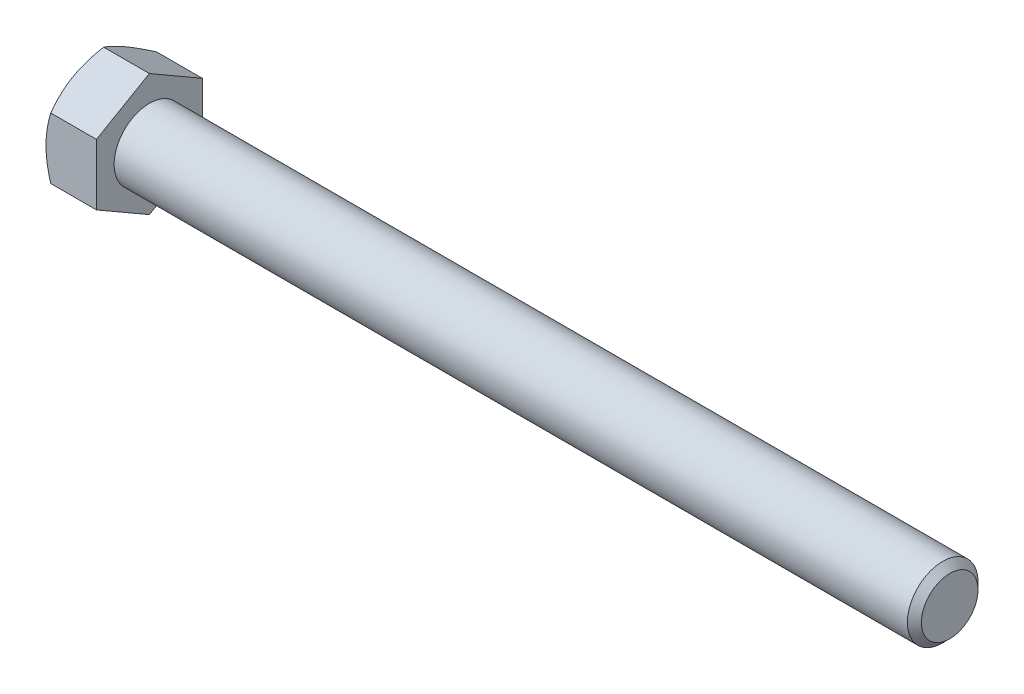
ISO-10303-21;
HEADER;
FILE_DESCRIPTION(('STEP AP214'),'2;1');
FILE_NAME('part.step','',(''),(''),'','','');
FILE_SCHEMA(('AUTOMOTIVE_DESIGN { 1 0 10303 214 1 1 1 1 }'));
ENDSEC;
DATA;
#1=APPLICATION_CONTEXT('core data for automotive mechanical design processes');
#2=APPLICATION_PROTOCOL_DEFINITION('international standard','automotive_design',2000,#1);
#3=PRODUCT_CONTEXT('',#1,'mechanical');
#4=PRODUCT('Part','Part','',(#3));
#5=PRODUCT_RELATED_PRODUCT_CATEGORY('part','',(#4));
#6=PRODUCT_DEFINITION_FORMATION('','',#4);
#7=PRODUCT_DEFINITION_CONTEXT('part definition',#1,'design');
#8=PRODUCT_DEFINITION('design','',#6,#7);
#9=PRODUCT_DEFINITION_SHAPE('','',#8);
#10=(LENGTH_UNIT() NAMED_UNIT(*) SI_UNIT(.MILLI.,.METRE.));
#11=(NAMED_UNIT(*) PLANE_ANGLE_UNIT() SI_UNIT($,.RADIAN.));
#12=(NAMED_UNIT(*) SI_UNIT($,.STERADIAN.) SOLID_ANGLE_UNIT());
#13=UNCERTAINTY_MEASURE_WITH_UNIT(LENGTH_MEASURE(1.E-05),#10,'distance_accuracy_value','');
#14=(GEOMETRIC_REPRESENTATION_CONTEXT(3) GLOBAL_UNCERTAINTY_ASSIGNED_CONTEXT((#13)) GLOBAL_UNIT_ASSIGNED_CONTEXT((#10,
#11,#12)) REPRESENTATION_CONTEXT('',''));
#15=CARTESIAN_POINT('',(0.,0.,0.));
#16=DIRECTION('',(0.,0.,1.));
#17=DIRECTION('',(1.,0.,0.));
#18=AXIS2_PLACEMENT_3D('',#15,#16,#17);
#19=CARTESIAN_POINT('',(6.8072,4.12077981131403,-7.1374));
#20=DIRECTION('',(0.,-0.866025403784438,0.500000000000001));
#21=DIRECTION('',(0.,-0.500000000000001,-0.866025403784438));
#22=AXIS2_PLACEMENT_3D('',#19,#20,#21);
#23=PLANE('',#22);
#24=CARTESIAN_POINT('',(0.637553523420348,8.24167509268191,0.000199999999999582));
#25=CARTESIAN_POINT('',(0.585265389565359,8.15109571898021,-0.156688077369111));
#26=CARTESIAN_POINT('',(0.535350289912886,8.06017862158373,-0.314161109336512));
#27=CARTESIAN_POINT('',(0.440919739394811,7.87760608276958,-0.630386022629451));
#28=CARTESIAN_POINT('',(0.396406617864103,7.78595034088604,-0.789138424377166));
#29=CARTESIAN_POINT('',(0.2718439466046,7.50951559742938,-1.26793744502137));
#30=CARTESIAN_POINT('',(0.200994122533562,7.32364541554993,-1.58987404364865));
#31=CARTESIAN_POINT('',(0.117914357261567,7.04549407114397,-2.07164630435335));
#32=CARTESIAN_POINT('',(0.0942473375753679,6.95404399131372,-2.23004248897558));
#33=CARTESIAN_POINT('',(0.0545611977075647,6.77073061920728,-2.54755056317072));
#34=CARTESIAN_POINT('',(0.0385414017966341,6.67886736416472,-2.70666238825308));
#35=CARTESIAN_POINT('',(0.0145579786669824,6.49498130931768,-3.02516237805154));
#36=CARTESIAN_POINT('',(0.00658520869042867,6.40295880983915,-3.18455002258784));
#37=CARTESIAN_POINT('',(-0.00114175893561541,6.21883388819856,-3.50346374180898));
#38=CARTESIAN_POINT('',(-0.000896210482461266,6.12673146859347,-3.66298981206503));
#39=CARTESIAN_POINT('',(0.0110730517201773,5.87440161908354,-4.10003793168242));
#40=CARTESIAN_POINT('',(0.0311658852990926,5.71425679021456,-4.37741691185292));
#41=CARTESIAN_POINT('',(0.0948800883359072,5.39503079963205,-4.93033254663834));
#42=CARTESIAN_POINT('',(0.13852323430896,5.23595076056063,-5.20586725678008));
#43=CARTESIAN_POINT('',(0.247618299095075,4.91608234409664,-5.75989560583231));
#44=CARTESIAN_POINT('',(0.31353243599271,4.75533432745402,-6.03831933787326));
#45=CARTESIAN_POINT('',(0.463130880450463,4.43623548204411,-6.59101475075978));
#46=CARTESIAN_POINT('',(0.546780048637372,4.27788056676996,-6.86529350964288));
#47=CARTESIAN_POINT('',(0.637553523420343,4.12066434126019,-7.1376));
#48=B_SPLINE_CURVE_WITH_KNOTS('',3,(#24,#25,#26,#27,#28,#29,#30,#31,#32,#33,#34,#35,#36,#37,#38,
#39,#40,#41,#42,#43,#44,#45,#46,#47),.UNSPECIFIED.,.F.,.F.,(4,2,2,2,2,2,2,2,2,2,2,4),(0.,
0.565616271543687,1.13147557690344,2.26554547664276,2.81869146049269,3.37178855781927,
3.9242565351942,4.47670744459711,5.43845614829341,6.40109569003608,7.3850851165131,
8.36714283329691),.UNSPECIFIED.);
#49=CARTESIAN_POINT('',(0.637486855352631,8.24155962262808,0.));
#50=VERTEX_POINT('',#49);
#51=CARTESIAN_POINT('',(0.,6.18116971697105,-3.56870000000001));
#52=VERTEX_POINT('',#51);
#53=EDGE_CURVE('E53',#50,#52,#48,.T.);
#54=ORIENTED_EDGE('',*,*,#53,.F.);
#55=DIRECTION('',(-1.,0.,0.));
#56=VECTOR('',#55,1.);
#57=CARTESIAN_POINT('',(6.8072,8.24155962262808,0.));
#58=LINE('',#57,#56);
#59=CARTESIAN_POINT('',(6.8072,8.24155962262808,0.));
#60=VERTEX_POINT('',#59);
#61=EDGE_CURVE('E149',#60,#50,#58,.T.);
#62=ORIENTED_EDGE('',*,*,#61,.F.);
#63=DIRECTION('',(0.,0.500000000000001,0.866025403784438));
#64=VECTOR('',#63,1.);
#65=CARTESIAN_POINT('',(6.8072,4.12077981131403,-7.1374));
#66=LINE('',#65,#64);
#67=CARTESIAN_POINT('',(6.8072,4.12077981131403,-7.1374));
#68=VERTEX_POINT('',#67);
#69=EDGE_CURVE('E240',#68,#60,#66,.T.);
#70=ORIENTED_EDGE('',*,*,#69,.F.);
#71=DIRECTION('',(-1.,0.,0.));
#72=VECTOR('',#71,1.);
#73=CARTESIAN_POINT('',(6.8072,4.12077981131403,-7.1374));
#74=LINE('',#73,#72);
#75=CARTESIAN_POINT('',(0.637486855352625,4.12077981131403,-7.1374));
#76=VERTEX_POINT('',#75);
#77=EDGE_CURVE('E137',#68,#76,#74,.T.);
#78=ORIENTED_EDGE('',*,*,#77,.T.);
#79=EDGE_CURVE('E131',#52,#76,#48,.T.);
#80=ORIENTED_EDGE('',*,*,#79,.F.);
#81=EDGE_LOOP('',(#54,#62,#70,#78,#80));
#82=FACE_BOUND('',#81,.T.);
#83=ADVANCED_FACE('F37',(#82),#23,.F.);
#84=CARTESIAN_POINT('',(6.8072,8.24155962262808,0.));
#85=DIRECTION('',(0.,-0.866025403784438,-0.500000000000001));
#86=DIRECTION('',(0.,0.500000000000001,-0.866025403784438));
#87=AXIS2_PLACEMENT_3D('',#84,#85,#86);
#88=PLANE('',#87);
#89=CARTESIAN_POINT('',(0.637553523420344,4.12066434126019,7.1376));
#90=CARTESIAN_POINT('',(0.585265389565354,4.21124371496189,6.98071192263089));
#91=CARTESIAN_POINT('',(0.535350289912882,4.30216081235838,6.82323889066349));
#92=CARTESIAN_POINT('',(0.440919739394807,4.48473335117252,6.50701397737055));
#93=CARTESIAN_POINT('',(0.3964066178641,4.57638909305606,6.34826157562283));
#94=CARTESIAN_POINT('',(0.271843946604597,4.85282383651273,5.86946255497863));
#95=CARTESIAN_POINT('',(0.20099412253356,5.03869401839218,5.54752595635135));
#96=CARTESIAN_POINT('',(0.117914357261566,5.31684536279814,5.06575369564665));
#97=CARTESIAN_POINT('',(0.094247337575367,5.40829544262839,4.90735751102442));
#98=CARTESIAN_POINT('',(0.0545611977075641,5.59160881473483,4.58984943682928));
#99=CARTESIAN_POINT('',(0.0385414017966333,5.68347206977738,4.43073761174692));
#100=CARTESIAN_POINT('',(0.0145579786669821,5.86735812462442,4.11223762194846));
#101=CARTESIAN_POINT('',(0.00658520869042904,5.95938062410295,3.95284997741216));
#102=CARTESIAN_POINT('',(-0.00114175893561427,6.14350554574354,3.63393625819102));
#103=CARTESIAN_POINT('',(-0.000896210482460006,6.23560796534864,3.47441018793497));
#104=CARTESIAN_POINT('',(0.0110730517201789,6.48793781485856,3.03736206831758));
#105=CARTESIAN_POINT('',(0.0311658852990944,6.64808264372754,2.75998308814708));
#106=CARTESIAN_POINT('',(0.0948800883359096,6.96730863431005,2.20706745336167));
#107=CARTESIAN_POINT('',(0.138523234308963,7.12638867338148,1.93153274321992));
#108=CARTESIAN_POINT('',(0.24761829909508,7.44625708984546,1.37750439416769));
#109=CARTESIAN_POINT('',(0.313532435992716,7.60700510648809,1.09908066212674));
#110=CARTESIAN_POINT('',(0.463130880450469,7.926103951898,0.546385249240216));
#111=CARTESIAN_POINT('',(0.546780048637379,8.08445886717215,0.272106490357122));
#112=CARTESIAN_POINT('',(0.637553523420349,8.24167509268191,-0.000199999999999955));
#113=B_SPLINE_CURVE_WITH_KNOTS('',3,(#89,#90,#91,#92,#93,#94,#95,#96,#97,#98,#99,#100,#101,#102,
#103,#104,#105,#106,#107,#108,#109,#110,#111,#112),.UNSPECIFIED.,.F.,.F.,(4,2,2,2,2,2,2,2,2,2,2,
4),(0.,0.565616271543686,1.13147557690344,2.26554547664276,2.81869146049269,3.37178855781927,
3.92425653519419,4.4767074445971,5.4384561482934,6.40109569003607,7.3850851165131,
8.36714283329691),.UNSPECIFIED.);
#114=CARTESIAN_POINT('',(0.637486855352626,4.12077981131403,7.1374));
#115=VERTEX_POINT('',#114);
#116=CARTESIAN_POINT('',(0.,6.18116971697105,3.56870000000001));
#117=VERTEX_POINT('',#116);
#118=EDGE_CURVE('E60',#115,#117,#113,.T.);
#119=ORIENTED_EDGE('',*,*,#118,.F.);
#120=DIRECTION('',(-1.,0.,0.));
#121=VECTOR('',#120,1.);
#122=CARTESIAN_POINT('',(6.8072,4.12077981131403,7.1374));
#123=LINE('',#122,#121);
#124=CARTESIAN_POINT('',(6.8072,4.12077981131403,7.1374));
#125=VERTEX_POINT('',#124);
#126=EDGE_CURVE('E147',#125,#115,#123,.T.);
#127=ORIENTED_EDGE('',*,*,#126,.F.);
#128=DIRECTION('',(0.,-0.500000000000001,0.866025403784438));
#129=VECTOR('',#128,1.);
#130=CARTESIAN_POINT('',(6.8072,8.24155962262808,0.));
#131=LINE('',#130,#129);
#132=EDGE_CURVE('E238',#60,#125,#131,.T.);
#133=ORIENTED_EDGE('',*,*,#132,.F.);
#134=ORIENTED_EDGE('',*,*,#61,.T.);
#135=EDGE_CURVE('E164',#117,#50,#113,.T.);
#136=ORIENTED_EDGE('',*,*,#135,.F.);
#137=EDGE_LOOP('',(#119,#127,#133,#134,#136));
#138=FACE_BOUND('',#137,.T.);
#139=ADVANCED_FACE('F170',(#138),#88,.F.);
#140=CARTESIAN_POINT('',(6.8072,4.12077981131403,7.1374));
#141=DIRECTION('',(0.,0.,-1.));
#142=DIRECTION('',(-1.,0.,0.));
#143=AXIS2_PLACEMENT_3D('',#140,#141,#142);
#144=PLANE('',#143);
#145=CARTESIAN_POINT('',(3.51793891464087,-11.1403587268437,7.1374));
#146=CARTESIAN_POINT('',(3.36611761361542,-10.8279722926893,7.1374));
#147=CARTESIAN_POINT('',(3.21573167435817,-10.5148763007017,7.1374));
#148=CARTESIAN_POINT('',(2.91863653133452,-9.88688803265219,7.1374));
#149=CARTESIAN_POINT('',(2.77192789362364,-9.57199548909054,7.1374));
#150=CARTESIAN_POINT('',(2.48227074397641,-8.93844907707202,7.1374));
#151=CARTESIAN_POINT('',(2.33934643030355,-8.61978410734441,7.1374));
#152=CARTESIAN_POINT('',(2.05925336317275,-7.97994405772779,7.1374));
#153=CARTESIAN_POINT('',(1.92208434228597,-7.65876909529408,7.1374));
#154=CARTESIAN_POINT('',(1.65065378230837,-7.00284865103085,7.1374));
#155=CARTESIAN_POINT('',(1.51663374065787,-6.66800268560584,7.1374));
#156=CARTESIAN_POINT('',(1.25856485288051,-5.99442084818065,7.1374));
#157=CARTESIAN_POINT('',(1.13451711533335,-5.6556845484785,7.1374));
#158=CARTESIAN_POINT('',(0.899596727677592,-4.97438980758155,7.1374));
#159=CARTESIAN_POINT('',(0.78869803674292,-4.63184044199148,7.1374));
#160=CARTESIAN_POINT('',(0.583585288609215,-3.94184101121261,7.1374));
#161=CARTESIAN_POINT('',(0.489366053461915,-3.5943925031972,7.1374));
#162=CARTESIAN_POINT('',(0.322585119775289,-2.89623643412328,7.1374));
#163=CARTESIAN_POINT('',(0.249906108267923,-2.54555766855628,7.1374));
#164=CARTESIAN_POINT('',(0.160162927876226,-2.01629019056175,7.1374));
#165=CARTESIAN_POINT('',(0.133459926561135,-1.83931395899738,7.1374));
#166=CARTESIAN_POINT('',(0.0870009608751859,-1.48445773938035,7.1374));
#167=CARTESIAN_POINT('',(0.0672443235865576,-1.3065778405635,7.1374));
#168=CARTESIAN_POINT('',(0.0353233928817906,-0.952509042934671,7.1374));
#169=CARTESIAN_POINT('',(0.023062060656036,-0.776328928434241,7.1374));
#170=CARTESIAN_POINT('',(0.00600431660240745,-0.423607840789669,7.1374));
#171=CARTESIAN_POINT('',(0.00120777872271182,-0.247066873789353,7.1374));
#172=CARTESIAN_POINT('',(-0.000805707966080717,0.106061109313543,7.1374));
#173=CARTESIAN_POINT('',(0.00197740745485924,0.282648125793668,7.1374));
#174=CARTESIAN_POINT('',(0.015054364225325,0.635545980126708,7.1374));
#175=CARTESIAN_POINT('',(0.0253485677088154,0.811856804252741,7.1374));
#176=CARTESIAN_POINT('',(0.0587173546676621,1.23335791869126,7.1374));
#177=CARTESIAN_POINT('',(0.0852317102922988,1.47828183508495,7.1374));
#178=CARTESIAN_POINT('',(0.151325348901078,1.96634766484074,7.1374));
#179=CARTESIAN_POINT('',(0.190906342916657,2.20948934056,7.1374));
#180=CARTESIAN_POINT('',(0.327153349211707,2.93593608611635,7.1374));
#181=CARTESIAN_POINT('',(0.441300495017733,3.41600789467397,7.1374));
#182=CARTESIAN_POINT('',(0.639740105584513,4.13409780337111,7.1374));
#183=CARTESIAN_POINT('',(0.71138683927974,4.37582477933243,7.1374));
#184=CARTESIAN_POINT('',(0.862240726867138,4.85693123459408,7.1374));
#185=CARTESIAN_POINT('',(0.941447936163006,5.09631069667749,7.1374));
#186=CARTESIAN_POINT('',(1.10614180608764,5.57279746249284,7.1374));
#187=CARTESIAN_POINT('',(1.19162653724197,5.809905439274,7.1374));
#188=CARTESIAN_POINT('',(1.36785754588297,6.28214651090287,7.1374));
#189=CARTESIAN_POINT('',(1.4586037216663,6.51727964382365,7.1374));
#190=CARTESIAN_POINT('',(1.70099135878086,7.12822933634872,7.1374));
#191=CARTESIAN_POINT('',(1.85611245200932,7.50266378649049,7.1374));
#192=CARTESIAN_POINT('',(2.17492034788947,8.24788094227112,7.1374));
#193=CARTESIAN_POINT('',(2.338607954525,8.61866330125998,7.1374));
#194=CARTESIAN_POINT('',(2.67260301704527,9.35737269718075,7.1374));
#195=CARTESIAN_POINT('',(2.8429126440593,9.7252987493811,7.1374));
#196=CARTESIAN_POINT('',(3.18863367809308,10.4587232704181,7.1374));
#197=CARTESIAN_POINT('',(3.36404491157502,10.8242218213112,7.1374));
#198=CARTESIAN_POINT('',(3.7191549662705,11.553777334436,7.1374));
#199=CARTESIAN_POINT('',(3.89885959822867,11.9178314626509,7.1374));
#200=CARTESIAN_POINT('',(4.26150568432078,12.6443245246618,7.1374));
#201=CARTESIAN_POINT('',(4.44444716083244,13.0067634472695,7.1374));
#202=CARTESIAN_POINT('',(4.81291716764717,13.7302353242129,7.1374));
#203=CARTESIAN_POINT('',(4.99844519827985,14.0912685333268,7.1374));
#204=CARTESIAN_POINT('',(5.37165471040538,14.8122208146436,7.1374));
#205=CARTESIAN_POINT('',(5.55933620037512,15.1721398824536,7.1374));
#206=CARTESIAN_POINT('',(6.08751400276291,16.1789579520409,7.1374));
#207=CARTESIAN_POINT('',(6.43000254365915,16.8248116492745,7.1374));
#208=CARTESIAN_POINT('',(7.11919785487999,18.1143032770824,7.1374));
#209=CARTESIAN_POINT('',(7.46590484738288,18.7579410886393,7.1374));
#210=CARTESIAN_POINT('',(8.16140637459832,20.0415314633598,7.1374));
#211=CARTESIAN_POINT('',(8.51019123426674,20.6814892741016,7.1374));
#212=CARTESIAN_POINT('',(9.21019417047445,21.9600146152104,7.1374));
#213=CARTESIAN_POINT('',(9.56141207357471,22.598582240497,7.1374));
#214=CARTESIAN_POINT('',(9.9135191344137,23.2366555668876,7.1374));
#215=B_SPLINE_CURVE_WITH_KNOTS('',3,(#145,#146,#147,#148,#149,#150,#151,#152,#153,#154,#155,
#156,#157,#158,#159,#160,#161,#162,#163,#164,#165,#166,#167,#168,#169,#170,#171,#172,#173,#174,
#175,#176,#177,#178,#179,#180,#181,#182,#183,#184,#185,#186,#187,#188,#189,#190,#191,#192,#193,
#194,#195,#196,#197,#198,#199,#200,#201,#202,#203,#204,#205,#206,#207,#208,#209,#210,#211,#212,
#213,#214),.UNSPECIFIED.,.F.,.F.,(4,2,2,2,2,2,2,2,2,2,2,2,2,2,2,2,2,2,2,2,2,2,2,2,2,2,2,2,2,2,2,
2,2,2,4),(0.,1.0419888362068,2.08413709519682,3.13183784368231,4.17948985504911,
5.26137797247103,6.34338619307611,7.42321444996099,8.50270689628368,9.57620733057732,
10.113030795566,10.6498022423129,11.179468394122,11.7091256017988,12.2387872978086,
12.7684745322176,13.5071235743819,14.245869378494,15.7241255438818,16.4804246089875,
17.2367292167316,17.9928023300467,18.7488608333938,19.9645892594812,21.1804319893616,
22.3966767697582,23.6128802262777,24.8308351286452,26.0487984545624,27.2665296678531,
28.4842656762731,30.6773737382255,32.8705978115956,35.0570894097064,37.2434267159856),.UNSPECIFIED.);
#216=CARTESIAN_POINT('',(0.637486855352626,-4.12077981131403,7.1374));
#217=VERTEX_POINT('',#216);
#218=CARTESIAN_POINT('',(0.,0.,7.1374));
#219=VERTEX_POINT('',#218);
#220=EDGE_CURVE('E250',#217,#219,#215,.T.);
#221=ORIENTED_EDGE('',*,*,#220,.F.);
#222=DIRECTION('',(-1.,0.,0.));
#223=VECTOR('',#222,1.);
#224=CARTESIAN_POINT('',(6.8072,-4.12077981131403,7.1374));
#225=LINE('',#224,#223);
#226=CARTESIAN_POINT('',(6.8072,-4.12077981131403,7.1374));
#227=VERTEX_POINT('',#226);
#228=EDGE_CURVE('E139',#227,#217,#225,.T.);
#229=ORIENTED_EDGE('',*,*,#228,.F.);
#230=DIRECTION('',(0.,-1.,0.));
#231=VECTOR('',#230,1.);
#232=CARTESIAN_POINT('',(6.8072,4.12077981131403,7.1374));
#233=LINE('',#232,#231);
#234=EDGE_CURVE('E234',#125,#227,#233,.T.);
#235=ORIENTED_EDGE('',*,*,#234,.F.);
#236=ORIENTED_EDGE('',*,*,#126,.T.);
#237=EDGE_CURVE('E188',#219,#115,#215,.T.);
#238=ORIENTED_EDGE('',*,*,#237,.F.);
#239=EDGE_LOOP('',(#221,#229,#235,#236,#238));
#240=FACE_BOUND('',#239,.T.);
#241=ADVANCED_FACE('F256',(#240),#144,.F.);
#242=CARTESIAN_POINT('',(6.8072,-8.24155962262808,0.));
#243=DIRECTION('',(0.,0.866025403784438,-0.500000000000002));
#244=DIRECTION('',(0.,0.500000000000002,0.866025403784438));
#245=AXIS2_PLACEMENT_3D('',#242,#243,#244);
#246=PLANE('',#245);
#247=CARTESIAN_POINT('',(0.637553523420353,-8.24167509268192,-0.000200000000000067));
#248=CARTESIAN_POINT('',(0.585265389565364,-8.15109571898022,0.15668807736911));
#249=CARTESIAN_POINT('',(0.535350289912891,-8.06017862158374,0.314161109336512));
#250=CARTESIAN_POINT('',(0.440919739394815,-7.87760608276959,0.63038602262945));
#251=CARTESIAN_POINT('',(0.396406617864107,-7.78595034088605,0.789138424377166));
#252=CARTESIAN_POINT('',(0.271843946604603,-7.50951559742939,1.26793744502137));
#253=CARTESIAN_POINT('',(0.200994122533565,-7.32364541554993,1.58987404364865));
#254=CARTESIAN_POINT('',(0.11791435726157,-7.04549407114397,2.07164630435335));
#255=CARTESIAN_POINT('',(0.0942473375753707,-6.95404399131372,2.23004248897558));
#256=CARTESIAN_POINT('',(0.0545611977075674,-6.77073061920728,2.54755056317072));
#257=CARTESIAN_POINT('',(0.0385414017966367,-6.67886736416473,2.70666238825308));
#258=CARTESIAN_POINT('',(0.0145579786669845,-6.49498130931769,3.02516237805154));
#259=CARTESIAN_POINT('',(0.00658520869043039,-6.40295880983915,3.18455002258784));
#260=CARTESIAN_POINT('',(-0.00114175893561386,-6.21883388819856,3.50346374180898));
#261=CARTESIAN_POINT('',(-0.000896210482459503,-6.12673146859347,3.66298981206503));
#262=CARTESIAN_POINT('',(0.011073051720179,-5.87440161908355,4.10003793168242));
#263=CARTESIAN_POINT('',(0.0311658852990936,-5.71425679021456,4.37741691185292));
#264=CARTESIAN_POINT('',(0.0948800883359078,-5.39503079963205,4.93033254663834));
#265=CARTESIAN_POINT('',(0.138523234308961,-5.23595076056063,5.20586725678008));
#266=CARTESIAN_POINT('',(0.247618299095076,-4.91608234409664,5.75989560583231));
#267=CARTESIAN_POINT('',(0.313532435992711,-4.75533432745402,6.03831933787326));
#268=CARTESIAN_POINT('',(0.463130880450463,-4.43623548204411,6.59101475075978));
#269=CARTESIAN_POINT('',(0.546780048637372,-4.27788056676996,6.86529350964288));
#270=CARTESIAN_POINT('',(0.637553523420342,-4.12066434126019,7.1376));
#271=B_SPLINE_CURVE_WITH_KNOTS('',3,(#247,#248,#249,#250,#251,#252,#253,#254,#255,#256,#257,
#258,#259,#260,#261,#262,#263,#264,#265,#266,#267,#268,#269,#270),.UNSPECIFIED.,.F.,.F.,(4,2,2,
2,2,2,2,2,2,2,2,4),(0.,0.565616271543688,1.13147557690344,2.26554547664277,2.81869146049269,
3.37178855781927,3.9242565351942,4.47670744459711,5.43845614829341,6.40109569003608,
7.38508511651311,8.36714283329692),.UNSPECIFIED.);
#272=CARTESIAN_POINT('',(0.637486855352636,-8.24155962262808,0.));
#273=VERTEX_POINT('',#272);
#274=CARTESIAN_POINT('',(0.,-6.18116971697104,3.56870000000001));
#275=VERTEX_POINT('',#274);
#276=EDGE_CURVE('E172',#273,#275,#271,.T.);
#277=ORIENTED_EDGE('',*,*,#276,.F.);
#278=DIRECTION('',(-1.,0.,0.));
#279=VECTOR('',#278,1.);
#280=CARTESIAN_POINT('',(6.8072,-8.24155962262808,0.));
#281=LINE('',#280,#279);
#282=CARTESIAN_POINT('',(6.8072,-8.24155962262808,0.));
#283=VERTEX_POINT('',#282);
#284=EDGE_CURVE('E136',#283,#273,#281,.T.);
#285=ORIENTED_EDGE('',*,*,#284,.F.);
#286=DIRECTION('',(0.,-0.500000000000002,-0.866025403784438));
#287=VECTOR('',#286,1.);
#288=CARTESIAN_POINT('',(6.8072,-8.24155962262808,0.));
#289=LINE('',#288,#287);
#290=EDGE_CURVE('E232',#227,#283,#289,.T.);
#291=ORIENTED_EDGE('',*,*,#290,.F.);
#292=ORIENTED_EDGE('',*,*,#228,.T.);
#293=EDGE_CURVE('E174',#275,#217,#271,.T.);
#294=ORIENTED_EDGE('',*,*,#293,.F.);
#295=EDGE_LOOP('',(#277,#285,#291,#292,#294));
#296=FACE_BOUND('',#295,.T.);
#297=ADVANCED_FACE('F228',(#296),#246,.F.);
#298=CARTESIAN_POINT('',(6.8072,-4.12077981131404,-7.1374));
#299=DIRECTION('',(0.,0.866025403784438,0.500000000000001));
#300=DIRECTION('',(0.,-0.500000000000001,0.866025403784438));
#301=AXIS2_PLACEMENT_3D('',#298,#299,#300);
#302=PLANE('',#301);
#303=CARTESIAN_POINT('',(0.637553523420347,-4.12066434126021,-7.1376));
#304=CARTESIAN_POINT('',(0.585265389565358,-4.2112437149619,-6.98071192263089));
#305=CARTESIAN_POINT('',(0.535350289912886,-4.30216081235839,-6.82323889066349));
#306=CARTESIAN_POINT('',(0.440919739394811,-4.48473335117254,-6.50701397737055));
#307=CARTESIAN_POINT('',(0.396406617864103,-4.57638909305608,-6.34826157562283));
#308=CARTESIAN_POINT('',(0.271843946604601,-4.85282383651274,-5.86946255497863));
#309=CARTESIAN_POINT('',(0.200994122533564,-5.03869401839219,-5.54752595635135));
#310=CARTESIAN_POINT('',(0.11791435726157,-5.31684536279815,-5.06575369564664));
#311=CARTESIAN_POINT('',(0.0942473375753706,-5.4082954426284,-4.90735751102441));
#312=CARTESIAN_POINT('',(0.0545611977075683,-5.59160881473484,-4.58984943682928));
#313=CARTESIAN_POINT('',(0.0385414017966383,-5.68347206977739,-4.43073761174692));
#314=CARTESIAN_POINT('',(0.0145579786669876,-5.86735812462443,-4.11223762194845));
#315=CARTESIAN_POINT('',(0.00658520869043416,-5.95938062410297,-3.95284997741216));
#316=CARTESIAN_POINT('',(-0.00114175893560937,-6.14350554574356,-3.63393625819102));
#317=CARTESIAN_POINT('',(-0.000896210482454987,-6.23560796534865,-3.47441018793497));
#318=CARTESIAN_POINT('',(0.0110730517201842,-6.48793781485857,-3.03736206831757));
#319=CARTESIAN_POINT('',(0.0311658852990998,-6.64808264372755,-2.75998308814708));
#320=CARTESIAN_POINT('',(0.0948800883359153,-6.96730863431006,-2.20706745336166));
#321=CARTESIAN_POINT('',(0.138523234308969,-7.12638867338149,-1.93153274321992));
#322=CARTESIAN_POINT('',(0.247618299095085,-7.44625708984547,-1.37750439416769));
#323=CARTESIAN_POINT('',(0.313532435992721,-7.6070051064881,-1.09908066212674));
#324=CARTESIAN_POINT('',(0.463130880450474,-7.92610395189801,-0.546385249240215));
#325=CARTESIAN_POINT('',(0.546780048637383,-8.08445886717216,-0.272106490357122));
#326=CARTESIAN_POINT('',(0.637553523420353,-8.24167509268192,0.000200000000000249));
#327=B_SPLINE_CURVE_WITH_KNOTS('',3,(#303,#304,#305,#306,#307,#308,#309,#310,#311,#312,#313,
#314,#315,#316,#317,#318,#319,#320,#321,#322,#323,#324,#325,#326),.UNSPECIFIED.,.F.,.F.,(4,2,2,
2,2,2,2,2,2,2,2,4),(0.,0.565616271543688,1.13147557690344,2.26554547664276,2.81869146049269,
3.37178855781927,3.9242565351942,4.4767074445971,5.43845614829341,6.40109569003607,
7.3850851165131,8.36714283329691),.UNSPECIFIED.);
#328=CARTESIAN_POINT('',(0.63748685535263,-4.12077981131404,-7.1374));
#329=VERTEX_POINT('',#328);
#330=CARTESIAN_POINT('',(0.,-6.18116971697105,-3.5687));
#331=VERTEX_POINT('',#330);
#332=EDGE_CURVE('E113',#329,#331,#327,.T.);
#333=ORIENTED_EDGE('',*,*,#332,.F.);
#334=DIRECTION('',(-1.,0.,0.));
#335=VECTOR('',#334,1.);
#336=CARTESIAN_POINT('',(6.8072,-4.12077981131404,-7.1374));
#337=LINE('',#336,#335);
#338=CARTESIAN_POINT('',(6.8072,-4.12077981131404,-7.1374));
#339=VERTEX_POINT('',#338);
#340=EDGE_CURVE('E127',#339,#329,#337,.T.);
#341=ORIENTED_EDGE('',*,*,#340,.F.);
#342=DIRECTION('',(0.,0.500000000000001,-0.866025403784438));
#343=VECTOR('',#342,1.);
#344=CARTESIAN_POINT('',(6.8072,-4.12077981131404,-7.1374));
#345=LINE('',#344,#343);
#346=EDGE_CURVE('E230',#283,#339,#345,.T.);
#347=ORIENTED_EDGE('',*,*,#346,.F.);
#348=ORIENTED_EDGE('',*,*,#284,.T.);
#349=EDGE_CURVE('E130',#331,#273,#327,.T.);
#350=ORIENTED_EDGE('',*,*,#349,.F.);
#351=EDGE_LOOP('',(#333,#341,#347,#348,#350));
#352=FACE_BOUND('',#351,.T.);
#353=ADVANCED_FACE('F125',(#352),#302,.F.);
#354=CARTESIAN_POINT('',(6.8072,4.12077981131403,-7.1374));
#355=DIRECTION('',(0.,0.,1.));
#356=DIRECTION('',(1.,0.,0.));
#357=AXIS2_PLACEMENT_3D('',#354,#355,#356);
#358=PLANE('',#357);
#359=CARTESIAN_POINT('',(3.51793891464088,-11.1403587268438,-7.1374));
#360=CARTESIAN_POINT('',(3.36611761361543,-10.8279722926893,-7.1374));
#361=CARTESIAN_POINT('',(3.21573167435818,-10.5148763007017,-7.1374));
#362=CARTESIAN_POINT('',(2.91863653133453,-9.88688803265221,-7.1374));
#363=CARTESIAN_POINT('',(2.77192789362365,-9.57199548909056,-7.1374));
#364=CARTESIAN_POINT('',(2.48227074397642,-8.93844907707204,-7.1374));
#365=CARTESIAN_POINT('',(2.33934643030356,-8.61978410734443,-7.1374));
#366=CARTESIAN_POINT('',(2.05925336317276,-7.97994405772781,-7.1374));
#367=CARTESIAN_POINT('',(1.92208434228598,-7.65876909529411,-7.1374));
#368=CARTESIAN_POINT('',(1.65065378230838,-7.00284865103087,-7.1374));
#369=CARTESIAN_POINT('',(1.51663374065788,-6.66800268560586,-7.1374));
#370=CARTESIAN_POINT('',(1.25856485288051,-5.99442084818067,-7.1374));
#371=CARTESIAN_POINT('',(1.13451711533335,-5.65568454847852,-7.1374));
#372=CARTESIAN_POINT('',(0.899596727677598,-4.97438980758156,-7.1374));
#373=CARTESIAN_POINT('',(0.788698036742925,-4.6318404419915,-7.1374));
#374=CARTESIAN_POINT('',(0.583585288609219,-3.94184101121262,-7.1374));
#375=CARTESIAN_POINT('',(0.489366053461919,-3.59439250319721,-7.1374));
#376=CARTESIAN_POINT('',(0.322585119775292,-2.8962364341233,-7.1374));
#377=CARTESIAN_POINT('',(0.249906108267925,-2.54555766855629,-7.1374));
#378=CARTESIAN_POINT('',(0.160162927876228,-2.01629019056176,-7.1374));
#379=CARTESIAN_POINT('',(0.133459926561136,-1.8393139589974,-7.1374));
#380=CARTESIAN_POINT('',(0.0870009608751871,-1.48445773938036,-7.1374));
#381=CARTESIAN_POINT('',(0.0672443235865584,-1.30657784056351,-7.1374));
#382=CARTESIAN_POINT('',(0.0353233928817909,-0.952509042934684,-7.1374));
#383=CARTESIAN_POINT('',(0.0230620606560362,-0.776328928434254,-7.1374));
#384=CARTESIAN_POINT('',(0.0060043166024073,-0.423607840789682,-7.1374));
#385=CARTESIAN_POINT('',(0.00120777872271151,-0.247066873789366,-7.1374));
#386=CARTESIAN_POINT('',(-0.000805707966081406,0.10606110931353,-7.1374));
#387=CARTESIAN_POINT('',(0.00197740745485832,0.282648125793655,-7.1374));
#388=CARTESIAN_POINT('',(0.0150543642253239,0.635545980126695,-7.1374));
#389=CARTESIAN_POINT('',(0.0253485677088145,0.811856804252728,-7.1374));
#390=CARTESIAN_POINT('',(0.058717354667661,1.23335791869125,-7.1374));
#391=CARTESIAN_POINT('',(0.0852317102922972,1.47828183508493,-7.1374));
#392=CARTESIAN_POINT('',(0.151325348901076,1.96634766484072,-7.1374));
#393=CARTESIAN_POINT('',(0.190906342916654,2.20948934055998,-7.1374));
#394=CARTESIAN_POINT('',(0.327153349211703,2.93593608611633,-7.1374));
#395=CARTESIAN_POINT('',(0.441300495017729,3.41600789467395,-7.1374));
#396=CARTESIAN_POINT('',(0.639740105584508,4.13409780337109,-7.1374));
#397=CARTESIAN_POINT('',(0.711386839279735,4.37582477933241,-7.1374));
#398=CARTESIAN_POINT('',(0.862240726867132,4.85693123459407,-7.1374));
#399=CARTESIAN_POINT('',(0.941447936163,5.09631069667747,-7.1374));
#400=CARTESIAN_POINT('',(1.10614180608763,5.57279746249282,-7.1374));
#401=CARTESIAN_POINT('',(1.19162653724196,5.80990543927398,-7.1374));
#402=CARTESIAN_POINT('',(1.36785754588296,6.28214651090285,-7.1374));
#403=CARTESIAN_POINT('',(1.4586037216663,6.51727964382363,-7.1374));
#404=CARTESIAN_POINT('',(1.70099135878086,7.1282293363487,-7.1374));
#405=CARTESIAN_POINT('',(1.85611245200931,7.50266378649047,-7.1374));
#406=CARTESIAN_POINT('',(2.17492034788947,8.2478809422711,-7.1374));
#407=CARTESIAN_POINT('',(2.338607954525,8.61866330125997,-7.1374));
#408=CARTESIAN_POINT('',(2.67260301704526,9.35737269718074,-7.1374));
#409=CARTESIAN_POINT('',(2.8429126440593,9.72529874938109,-7.1374));
#410=CARTESIAN_POINT('',(3.18863367809308,10.4587232704181,-7.1374));
#411=CARTESIAN_POINT('',(3.36404491157501,10.8242218213111,-7.1374));
#412=CARTESIAN_POINT('',(3.7191549662705,11.553777334436,-7.1374));
#413=CARTESIAN_POINT('',(3.89885959822867,11.9178314626509,-7.1374));
#414=CARTESIAN_POINT('',(4.26150568432077,12.6443245246618,-7.1374));
#415=CARTESIAN_POINT('',(4.44444716083244,13.0067634472695,-7.1374));
#416=CARTESIAN_POINT('',(4.81291716764717,13.7302353242129,-7.1374));
#417=CARTESIAN_POINT('',(4.99844519827985,14.0912685333268,-7.1374));
#418=CARTESIAN_POINT('',(5.37165471040538,14.8122208146436,-7.1374));
#419=CARTESIAN_POINT('',(5.55933620037512,15.1721398824536,-7.1374));
#420=CARTESIAN_POINT('',(6.08751400276291,16.1789579520409,-7.1374));
#421=CARTESIAN_POINT('',(6.43000254365915,16.8248116492745,-7.1374));
#422=CARTESIAN_POINT('',(7.11919785487998,18.1143032770824,-7.1374));
#423=CARTESIAN_POINT('',(7.46590484738288,18.7579410886393,-7.1374));
#424=CARTESIAN_POINT('',(8.16140637459832,20.0415314633598,-7.1374));
#425=CARTESIAN_POINT('',(8.51019123426675,20.6814892741017,-7.1374));
#426=CARTESIAN_POINT('',(9.21019417047446,21.9600146152104,-7.1374));
#427=CARTESIAN_POINT('',(9.56141207357472,22.598582240497,-7.1374));
#428=CARTESIAN_POINT('',(9.9135191344137,23.2366555668876,-7.1374));
#429=B_SPLINE_CURVE_WITH_KNOTS('',3,(#359,#360,#361,#362,#363,#364,#365,#366,#367,#368,#369,
#370,#371,#372,#373,#374,#375,#376,#377,#378,#379,#380,#381,#382,#383,#384,#385,#386,#387,#388,
#389,#390,#391,#392,#393,#394,#395,#396,#397,#398,#399,#400,#401,#402,#403,#404,#405,#406,#407,
#408,#409,#410,#411,#412,#413,#414,#415,#416,#417,#418,#419,#420,#421,#422,#423,#424,#425,#426,
#427,#428),.UNSPECIFIED.,.F.,.F.,(4,2,2,2,2,2,2,2,2,2,2,2,2,2,2,2,2,2,2,2,2,2,2,2,2,2,2,2,2,2,2,
2,2,2,4),(0.,1.0419888362068,2.08413709519682,3.13183784368231,4.17948985504911,
5.26137797247103,6.34338619307611,7.42321444996099,8.50270689628369,9.57620733057733,
10.113030795566,10.6498022423129,11.179468394122,11.7091256017988,12.2387872978086,
12.7684745322176,13.507123574382,14.245869378494,15.7241255438818,16.4804246089875,
17.2367292167316,17.9928023300467,18.7488608333938,19.9645892594812,21.1804319893616,
22.3966767697582,23.6128802262777,24.8308351286452,26.0487984545625,27.2665296678531,
28.4842656762731,30.6773737382256,32.8705978115956,35.0570894097065,37.2434267159856),.UNSPECIFIED.);
#430=CARTESIAN_POINT('',(0.,0.,-7.1374));
#431=VERTEX_POINT('',#430);
#432=EDGE_CURVE('E119',#76,#431,#429,.F.);
#433=ORIENTED_EDGE('',*,*,#432,.F.);
#434=ORIENTED_EDGE('',*,*,#77,.F.);
#435=DIRECTION('',(0.,1.,0.));
#436=VECTOR('',#435,1.);
#437=CARTESIAN_POINT('',(6.8072,4.12077981131403,-7.1374));
#438=LINE('',#437,#436);
#439=EDGE_CURVE('E135',#339,#68,#438,.T.);
#440=ORIENTED_EDGE('',*,*,#439,.F.);
#441=ORIENTED_EDGE('',*,*,#340,.T.);
#442=EDGE_CURVE('E110',#431,#329,#429,.F.);
#443=ORIENTED_EDGE('',*,*,#442,.F.);
#444=EDGE_LOOP('',(#433,#434,#440,#441,#443));
#445=FACE_BOUND('',#444,.T.);
#446=ADVANCED_FACE('F133',(#445),#358,.F.);
#447=CARTESIAN_POINT('',(6.8072,8.24155962262808,0.));
#448=DIRECTION('',(1.,0.,0.));
#449=DIRECTION('',(0.,0.,-1.));
#450=AXIS2_PLACEMENT_3D('',#447,#448,#449);
#451=PLANE('',#450);
#452=CARTESIAN_POINT('',(6.8072,0.,0.));
#453=DIRECTION('',(1.,0.,0.));
#454=DIRECTION('',(0.,0.,-1.));
#455=AXIS2_PLACEMENT_3D('',#452,#453,#454);
#456=CIRCLE('',#455,4.7625);
#457=CARTESIAN_POINT('',(6.8072,0.,-4.7625));
#458=VERTEX_POINT('',#457);
#459=EDGE_CURVE('E243',#458,#458,#456,.F.);
#460=ORIENTED_EDGE('',*,*,#459,.T.);
#461=EDGE_LOOP('',(#460));
#462=FACE_BOUND('',#461,.T.);
#463=ORIENTED_EDGE('',*,*,#69,.T.);
#464=ORIENTED_EDGE('',*,*,#132,.T.);
#465=ORIENTED_EDGE('',*,*,#234,.T.);
#466=ORIENTED_EDGE('',*,*,#290,.T.);
#467=ORIENTED_EDGE('',*,*,#346,.T.);
#468=ORIENTED_EDGE('',*,*,#439,.T.);
#469=EDGE_LOOP('',(#463,#464,#465,#466,#467,#468));
#470=FACE_BOUND('',#469,.T.);
#471=ADVANCED_FACE('F258',(#462,#470),#451,.T.);
#472=CARTESIAN_POINT('',(0.,0.,0.));
#473=DIRECTION('',(-1.,0.,0.));
#474=DIRECTION('',(0.,0.,1.));
#475=AXIS2_PLACEMENT_3D('',#472,#473,#474);
#476=CYLINDRICAL_SURFACE('',#475,4.7625);
#477=ORIENTED_EDGE('',*,*,#459,.F.);
#478=EDGE_LOOP('',(#477));
#479=FACE_BOUND('',#478,.T.);
#480=CARTESIAN_POINT('',(113.81105,0.,0.));
#481=DIRECTION('',(-1.,0.,0.));
#482=DIRECTION('',(0.,0.,1.));
#483=AXIS2_PLACEMENT_3D('',#480,#481,#482);
#484=CIRCLE('',#483,4.7625);
#485=CARTESIAN_POINT('',(113.81105,0.,4.7625));
#486=VERTEX_POINT('',#485);
#487=EDGE_CURVE('E246',#486,#486,#484,.T.);
#488=ORIENTED_EDGE('',*,*,#487,.T.);
#489=EDGE_LOOP('',(#488));
#490=FACE_BOUND('',#489,.T.);
#491=ADVANCED_FACE('F289',(#479,#490),#476,.T.);
#492=CARTESIAN_POINT('',(114.7572,0.,0.));
#493=DIRECTION('',(-1.,0.,0.));
#494=DIRECTION('',(0.,0.,1.));
#495=AXIS2_PLACEMENT_3D('',#492,#493,#494);
#496=CONICAL_SURFACE('',#495,3.81635,0.785398163397421);
#497=ORIENTED_EDGE('',*,*,#487,.F.);
#498=EDGE_LOOP('',(#497));
#499=FACE_BOUND('',#498,.T.);
#500=CARTESIAN_POINT('',(114.7572,0.,0.));
#501=DIRECTION('',(-1.,0.,0.));
#502=DIRECTION('',(0.,0.,1.));
#503=AXIS2_PLACEMENT_3D('',#500,#501,#502);
#504=CIRCLE('',#503,3.81635);
#505=CARTESIAN_POINT('',(114.7572,0.,3.81635));
#506=VERTEX_POINT('',#505);
#507=EDGE_CURVE('E248',#506,#506,#504,.T.);
#508=ORIENTED_EDGE('',*,*,#507,.T.);
#509=EDGE_LOOP('',(#508));
#510=FACE_BOUND('',#509,.T.);
#511=ADVANCED_FACE('F292',(#499,#510),#496,.T.);
#512=CARTESIAN_POINT('',(114.7572,0.,0.));
#513=DIRECTION('',(-1.,0.,0.));
#514=DIRECTION('',(0.,0.,1.));
#515=AXIS2_PLACEMENT_3D('',#512,#513,#514);
#516=PLANE('',#515);
#517=ORIENTED_EDGE('',*,*,#507,.F.);
#518=EDGE_LOOP('',(#517));
#519=FACE_BOUND('',#518,.T.);
#520=ADVANCED_FACE('F202',(#519),#516,.F.);
#521=CARTESIAN_POINT('',(0.,0.,0.));
#522=DIRECTION('',(1.,0.,0.));
#523=DIRECTION('',(0.,0.,-1.));
#524=AXIS2_PLACEMENT_3D('',#521,#522,#523);
#525=CONICAL_SURFACE('',#524,7.1374,1.0471975511966);
#526=ORIENTED_EDGE('',*,*,#332,.T.);
#527=CARTESIAN_POINT('',(0.,0.,0.));
#528=DIRECTION('',(1.,0.,0.));
#529=DIRECTION('',(0.,0.,-1.));
#530=AXIS2_PLACEMENT_3D('',#527,#528,#529);
#531=CIRCLE('',#530,7.1374);
#532=EDGE_CURVE('E41',#331,#431,#531,.T.);
#533=ORIENTED_EDGE('',*,*,#532,.T.);
#534=ORIENTED_EDGE('',*,*,#442,.T.);
#535=EDGE_LOOP('',(#526,#533,#534));
#536=FACE_BOUND('',#535,.T.);
#537=ADVANCED_FACE('F112',(#536),#525,.T.);
#538=ORIENTED_EDGE('',*,*,#276,.T.);
#539=EDGE_CURVE('E154',#275,#331,#531,.T.);
#540=ORIENTED_EDGE('',*,*,#539,.T.);
#541=ORIENTED_EDGE('',*,*,#349,.T.);
#542=EDGE_LOOP('',(#538,#540,#541));
#543=FACE_BOUND('',#542,.T.);
#544=ADVANCED_FACE('F201',(#543),#525,.T.);
#545=ORIENTED_EDGE('',*,*,#220,.T.);
#546=EDGE_CURVE('E155',#219,#275,#531,.T.);
#547=ORIENTED_EDGE('',*,*,#546,.T.);
#548=ORIENTED_EDGE('',*,*,#293,.T.);
#549=EDGE_LOOP('',(#545,#547,#548));
#550=FACE_BOUND('',#549,.T.);
#551=ADVANCED_FACE('F196',(#550),#525,.T.);
#552=ORIENTED_EDGE('',*,*,#237,.T.);
#553=ORIENTED_EDGE('',*,*,#118,.T.);
#554=CARTESIAN_POINT('',(0.,0.,0.));
#555=DIRECTION('',(-1.,0.,0.));
#556=DIRECTION('',(0.,0.,1.));
#557=AXIS2_PLACEMENT_3D('',#554,#555,#556);
#558=CIRCLE('',#557,7.1374);
#559=EDGE_CURVE('E120',#219,#117,#558,.T.);
#560=ORIENTED_EDGE('',*,*,#559,.F.);
#561=EDGE_LOOP('',(#552,#553,#560));
#562=FACE_BOUND('',#561,.T.);
#563=ADVANCED_FACE('F200',(#562),#525,.T.);
#564=ORIENTED_EDGE('',*,*,#135,.T.);
#565=ORIENTED_EDGE('',*,*,#53,.T.);
#566=EDGE_CURVE('E46',#52,#117,#531,.T.);
#567=ORIENTED_EDGE('',*,*,#566,.T.);
#568=EDGE_LOOP('',(#564,#565,#567));
#569=FACE_BOUND('',#568,.T.);
#570=ADVANCED_FACE('F163',(#569),#525,.T.);
#571=ORIENTED_EDGE('',*,*,#79,.T.);
#572=ORIENTED_EDGE('',*,*,#432,.T.);
#573=EDGE_CURVE('E11',#431,#52,#531,.T.);
#574=ORIENTED_EDGE('',*,*,#573,.T.);
#575=EDGE_LOOP('',(#571,#572,#574));
#576=FACE_BOUND('',#575,.T.);
#577=ADVANCED_FACE('F261',(#576),#525,.T.);
#578=CARTESIAN_POINT('',(0.,8.24155962262808,0.));
#579=DIRECTION('',(1.,0.,0.));
#580=DIRECTION('',(0.,0.,-1.));
#581=AXIS2_PLACEMENT_3D('',#578,#579,#580);
#582=PLANE('',#581);
#583=ORIENTED_EDGE('',*,*,#573,.F.);
#584=ORIENTED_EDGE('',*,*,#532,.F.);
#585=ORIENTED_EDGE('',*,*,#539,.F.);
#586=ORIENTED_EDGE('',*,*,#546,.F.);
#587=ORIENTED_EDGE('',*,*,#559,.T.);
#588=ORIENTED_EDGE('',*,*,#566,.F.);
#589=EDGE_LOOP('',(#583,#584,#585,#586,#587,#588));
#590=FACE_BOUND('',#589,.T.);
#591=ADVANCED_FACE('F167',(#590),#582,.F.);
#592=CLOSED_SHELL('',(#83,#139,#241,#297,#353,#446,#471,#491,#511,#520,#537,#544,#551,#563,#570,
#577,#591));
#593=MANIFOLD_SOLID_BREP('B2',#592);
#594=ADVANCED_BREP_SHAPE_REPRESENTATION('',(#18,#593),#14);
#595=SHAPE_DEFINITION_REPRESENTATION(#9,#594);
ENDSEC;
END-ISO-10303-21;
